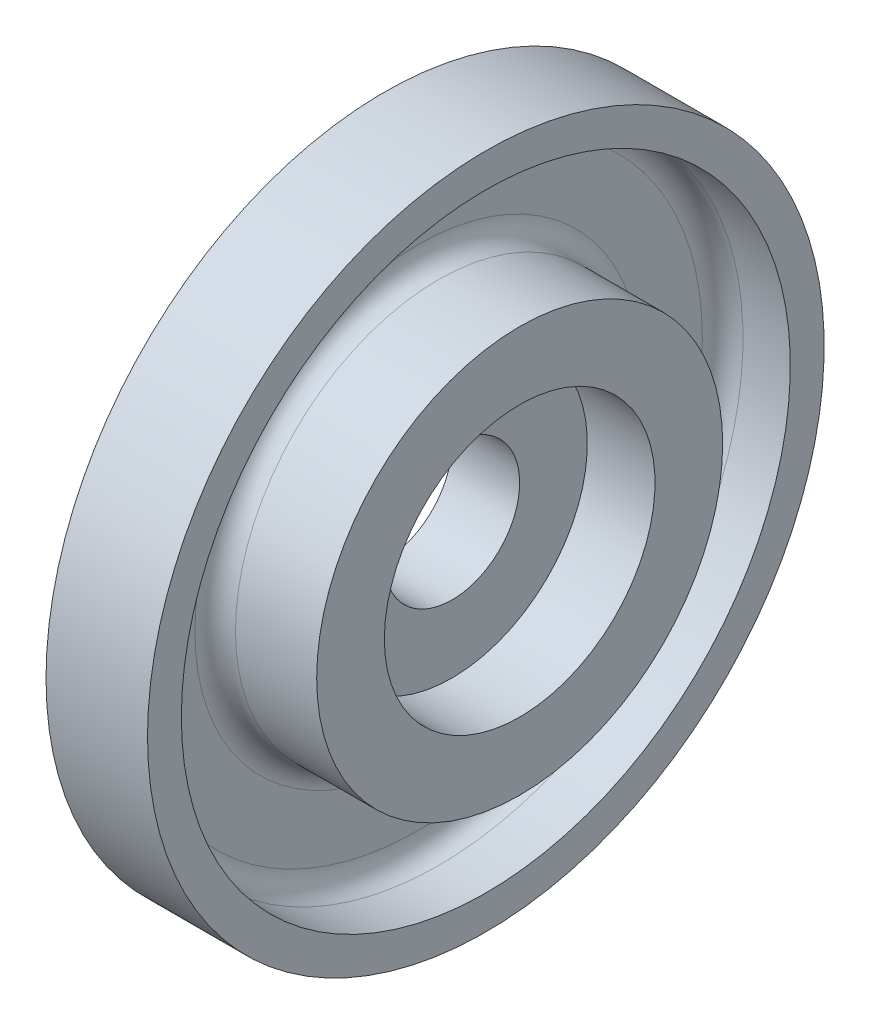
ISO-10303-21;
HEADER;
FILE_DESCRIPTION(('STEP AP214'),'2;1');
FILE_NAME('part.step','',(''),(''),'','','');
FILE_SCHEMA(('AUTOMOTIVE_DESIGN { 1 0 10303 214 1 1 1 1 }'));
ENDSEC;
DATA;
#1=APPLICATION_CONTEXT('core data for automotive mechanical design processes');
#2=APPLICATION_PROTOCOL_DEFINITION('international standard','automotive_design',2000,#1);
#3=PRODUCT_CONTEXT('',#1,'mechanical');
#4=PRODUCT('Part','Part','',(#3));
#5=PRODUCT_RELATED_PRODUCT_CATEGORY('part','',(#4));
#6=PRODUCT_DEFINITION_FORMATION('','',#4);
#7=PRODUCT_DEFINITION_CONTEXT('part definition',#1,'design');
#8=PRODUCT_DEFINITION('design','',#6,#7);
#9=PRODUCT_DEFINITION_SHAPE('','',#8);
#10=(LENGTH_UNIT() NAMED_UNIT(*) SI_UNIT(.MILLI.,.METRE.));
#11=(NAMED_UNIT(*) PLANE_ANGLE_UNIT() SI_UNIT($,.RADIAN.));
#12=(NAMED_UNIT(*) SI_UNIT($,.STERADIAN.) SOLID_ANGLE_UNIT());
#13=UNCERTAINTY_MEASURE_WITH_UNIT(LENGTH_MEASURE(1.E-05),#10,'distance_accuracy_value','');
#14=(GEOMETRIC_REPRESENTATION_CONTEXT(3) GLOBAL_UNCERTAINTY_ASSIGNED_CONTEXT((#13)) GLOBAL_UNIT_ASSIGNED_CONTEXT((#10,
#11,#12)) REPRESENTATION_CONTEXT('',''));
#15=CARTESIAN_POINT('',(0.,0.,0.));
#16=DIRECTION('',(0.,0.,1.));
#17=DIRECTION('',(1.,0.,0.));
#18=AXIS2_PLACEMENT_3D('',#15,#16,#17);
#19=CARTESIAN_POINT('',(-16.4847580469892,0.,0.));
#20=DIRECTION('',(-1.,0.,0.));
#21=DIRECTION('',(0.,0.,1.));
#22=AXIS2_PLACEMENT_3D('',#19,#20,#21);
#23=CYLINDRICAL_SURFACE('',#22,10.);
#24=CARTESIAN_POINT('',(10.,0.,0.));
#25=DIRECTION('',(-1.,0.,0.));
#26=DIRECTION('',(0.,0.,1.));
#27=AXIS2_PLACEMENT_3D('',#24,#25,#26);
#28=CIRCLE('',#27,10.);
#29=CARTESIAN_POINT('',(10.,0.,10.));
#30=VERTEX_POINT('',#29);
#31=EDGE_CURVE('E10',#30,#30,#28,.T.);
#32=ORIENTED_EDGE('',*,*,#31,.F.);
#33=EDGE_LOOP('',(#32));
#34=FACE_BOUND('',#33,.T.);
#35=CARTESIAN_POINT('',(0.,0.,0.));
#36=DIRECTION('',(-1.,0.,0.));
#37=DIRECTION('',(0.,0.,1.));
#38=AXIS2_PLACEMENT_3D('',#35,#36,#37);
#39=CIRCLE('',#38,9.99999999999999);
#40=CARTESIAN_POINT('',(0.,0.,9.99999999999999));
#41=VERTEX_POINT('',#40);
#42=EDGE_CURVE('E70',#41,#41,#39,.T.);
#43=ORIENTED_EDGE('',*,*,#42,.T.);
#44=EDGE_LOOP('',(#43));
#45=FACE_BOUND('',#44,.T.);
#46=ADVANCED_FACE('F30',(#34,#45),#23,.F.);
#47=CARTESIAN_POINT('',(10.,20.,0.));
#48=DIRECTION('',(-1.,0.,0.));
#49=DIRECTION('',(0.,0.,1.));
#50=AXIS2_PLACEMENT_3D('',#47,#48,#49);
#51=PLANE('',#50);
#52=CARTESIAN_POINT('',(10.,0.,0.));
#53=DIRECTION('',(-1.,0.,0.));
#54=DIRECTION('',(0.,0.,1.));
#55=AXIS2_PLACEMENT_3D('',#52,#53,#54);
#56=CIRCLE('',#55,20.);
#57=CARTESIAN_POINT('',(10.,0.,20.));
#58=VERTEX_POINT('',#57);
#59=EDGE_CURVE('E36',#58,#58,#56,.T.);
#60=ORIENTED_EDGE('',*,*,#59,.F.);
#61=EDGE_LOOP('',(#60));
#62=FACE_BOUND('',#61,.T.);
#63=ORIENTED_EDGE('',*,*,#31,.T.);
#64=EDGE_LOOP('',(#63));
#65=FACE_BOUND('',#64,.T.);
#66=ADVANCED_FACE('F131',(#62,#65),#51,.F.);
#67=CARTESIAN_POINT('',(-16.4847580469892,0.,0.));
#68=DIRECTION('',(-1.,0.,0.));
#69=DIRECTION('',(0.,0.,1.));
#70=AXIS2_PLACEMENT_3D('',#67,#68,#69);
#71=CYLINDRICAL_SURFACE('',#70,20.);
#72=CARTESIAN_POINT('',(20.,0.,0.));
#73=DIRECTION('',(-1.,0.,0.));
#74=DIRECTION('',(0.,0.,1.));
#75=AXIS2_PLACEMENT_3D('',#72,#73,#74);
#76=CIRCLE('',#75,20.);
#77=CARTESIAN_POINT('',(20.,0.,20.));
#78=VERTEX_POINT('',#77);
#79=EDGE_CURVE('E40',#78,#78,#76,.T.);
#80=ORIENTED_EDGE('',*,*,#79,.F.);
#81=EDGE_LOOP('',(#80));
#82=FACE_BOUND('',#81,.T.);
#83=ORIENTED_EDGE('',*,*,#59,.T.);
#84=EDGE_LOOP('',(#83));
#85=FACE_BOUND('',#84,.T.);
#86=ADVANCED_FACE('F126',(#82,#85),#71,.F.);
#87=CARTESIAN_POINT('',(20.,30.,0.));
#88=DIRECTION('',(-1.,0.,0.));
#89=DIRECTION('',(0.,0.,1.));
#90=AXIS2_PLACEMENT_3D('',#87,#88,#89);
#91=PLANE('',#90);
#92=CARTESIAN_POINT('',(20.,0.,0.));
#93=DIRECTION('',(-1.,0.,0.));
#94=DIRECTION('',(0.,0.,1.));
#95=AXIS2_PLACEMENT_3D('',#92,#93,#94);
#96=CIRCLE('',#95,30.);
#97=CARTESIAN_POINT('',(20.,0.,30.));
#98=VERTEX_POINT('',#97);
#99=EDGE_CURVE('E44',#98,#98,#96,.T.);
#100=ORIENTED_EDGE('',*,*,#99,.F.);
#101=EDGE_LOOP('',(#100));
#102=FACE_BOUND('',#101,.T.);
#103=ORIENTED_EDGE('',*,*,#79,.T.);
#104=EDGE_LOOP('',(#103));
#105=FACE_BOUND('',#104,.T.);
#106=ADVANCED_FACE('F120',(#102,#105),#91,.F.);
#107=CARTESIAN_POINT('',(-16.4847580469892,0.,0.));
#108=DIRECTION('',(-1.,0.,0.));
#109=DIRECTION('',(0.,0.,1.));
#110=AXIS2_PLACEMENT_3D('',#107,#108,#109);
#111=CYLINDRICAL_SURFACE('',#110,30.);
#112=CARTESIAN_POINT('',(8.00000000000002,0.,0.));
#113=DIRECTION('',(-1.,0.,0.));
#114=DIRECTION('',(0.,0.,1.));
#115=AXIS2_PLACEMENT_3D('',#112,#113,#114);
#116=CIRCLE('',#115,30.);
#117=CARTESIAN_POINT('',(8.00000000000002,0.,30.));
#118=VERTEX_POINT('',#117);
#119=EDGE_CURVE('E49',#118,#118,#116,.T.);
#120=ORIENTED_EDGE('',*,*,#119,.F.);
#121=EDGE_LOOP('',(#120));
#122=FACE_BOUND('',#121,.T.);
#123=ORIENTED_EDGE('',*,*,#99,.T.);
#124=EDGE_LOOP('',(#123));
#125=FACE_BOUND('',#124,.T.);
#126=ADVANCED_FACE('F114',(#122,#125),#111,.T.);
#127=CARTESIAN_POINT('',(8.,0.,0.));
#128=DIRECTION('',(-1.,0.,0.));
#129=DIRECTION('',(0.,0.,1.));
#130=AXIS2_PLACEMENT_3D('',#127,#128,#129);
#131=TOROIDAL_SURFACE('',#130,33.,3.);
#132=CARTESIAN_POINT('',(5.,0.,0.));
#133=DIRECTION('',(-1.,0.,0.));
#134=DIRECTION('',(0.,0.,1.));
#135=AXIS2_PLACEMENT_3D('',#132,#133,#134);
#136=CIRCLE('',#135,33.);
#137=CARTESIAN_POINT('',(5.,0.,33.));
#138=VERTEX_POINT('',#137);
#139=EDGE_CURVE('E52',#138,#138,#136,.T.);
#140=ORIENTED_EDGE('',*,*,#139,.F.);
#141=EDGE_LOOP('',(#140));
#142=FACE_BOUND('',#141,.T.);
#143=ORIENTED_EDGE('',*,*,#119,.T.);
#144=EDGE_LOOP('',(#143));
#145=FACE_BOUND('',#144,.T.);
#146=ADVANCED_FACE('F108',(#142,#145),#131,.F.);
#147=CARTESIAN_POINT('',(5.,42.,0.));
#148=DIRECTION('',(-1.,0.,0.));
#149=DIRECTION('',(0.,0.,1.));
#150=AXIS2_PLACEMENT_3D('',#147,#148,#149);
#151=PLANE('',#150);
#152=CARTESIAN_POINT('',(5.,0.,0.));
#153=DIRECTION('',(-1.,0.,0.));
#154=DIRECTION('',(0.,0.,1.));
#155=AXIS2_PLACEMENT_3D('',#152,#153,#154);
#156=CIRCLE('',#155,42.);
#157=CARTESIAN_POINT('',(5.,0.,42.));
#158=VERTEX_POINT('',#157);
#159=EDGE_CURVE('E55',#158,#158,#156,.T.);
#160=ORIENTED_EDGE('',*,*,#159,.F.);
#161=EDGE_LOOP('',(#160));
#162=FACE_BOUND('',#161,.T.);
#163=ORIENTED_EDGE('',*,*,#139,.T.);
#164=EDGE_LOOP('',(#163));
#165=FACE_BOUND('',#164,.T.);
#166=ADVANCED_FACE('F102',(#162,#165),#151,.F.);
#167=CARTESIAN_POINT('',(8.,0.,0.));
#168=DIRECTION('',(-1.,0.,0.));
#169=DIRECTION('',(0.,0.,1.));
#170=AXIS2_PLACEMENT_3D('',#167,#168,#169);
#171=TOROIDAL_SURFACE('',#170,42.,3.);
#172=CARTESIAN_POINT('',(8.00000000000002,0.,0.));
#173=DIRECTION('',(-1.,0.,0.));
#174=DIRECTION('',(0.,0.,1.));
#175=AXIS2_PLACEMENT_3D('',#172,#173,#174);
#176=CIRCLE('',#175,45.);
#177=CARTESIAN_POINT('',(8.00000000000002,0.,45.));
#178=VERTEX_POINT('',#177);
#179=EDGE_CURVE('E58',#178,#178,#176,.T.);
#180=ORIENTED_EDGE('',*,*,#179,.F.);
#181=EDGE_LOOP('',(#180));
#182=FACE_BOUND('',#181,.T.);
#183=ORIENTED_EDGE('',*,*,#159,.T.);
#184=EDGE_LOOP('',(#183));
#185=FACE_BOUND('',#184,.T.);
#186=ADVANCED_FACE('F96',(#182,#185),#171,.F.);
#187=CARTESIAN_POINT('',(-16.4847580469892,0.,0.));
#188=DIRECTION('',(-1.,0.,0.));
#189=DIRECTION('',(0.,0.,1.));
#190=AXIS2_PLACEMENT_3D('',#187,#188,#189);
#191=CYLINDRICAL_SURFACE('',#190,45.);
#192=CARTESIAN_POINT('',(15.,0.,0.));
#193=DIRECTION('',(-1.,0.,0.));
#194=DIRECTION('',(0.,0.,1.));
#195=AXIS2_PLACEMENT_3D('',#192,#193,#194);
#196=CIRCLE('',#195,45.);
#197=CARTESIAN_POINT('',(15.,0.,45.));
#198=VERTEX_POINT('',#197);
#199=EDGE_CURVE('E61',#198,#198,#196,.T.);
#200=ORIENTED_EDGE('',*,*,#199,.F.);
#201=EDGE_LOOP('',(#200));
#202=FACE_BOUND('',#201,.T.);
#203=ORIENTED_EDGE('',*,*,#179,.T.);
#204=EDGE_LOOP('',(#203));
#205=FACE_BOUND('',#204,.T.);
#206=ADVANCED_FACE('F90',(#202,#205),#191,.F.);
#207=CARTESIAN_POINT('',(15.,50.,0.));
#208=DIRECTION('',(-1.,0.,0.));
#209=DIRECTION('',(0.,0.,1.));
#210=AXIS2_PLACEMENT_3D('',#207,#208,#209);
#211=PLANE('',#210);
#212=CARTESIAN_POINT('',(15.,0.,0.));
#213=DIRECTION('',(-1.,0.,0.));
#214=DIRECTION('',(0.,0.,1.));
#215=AXIS2_PLACEMENT_3D('',#212,#213,#214);
#216=CIRCLE('',#215,50.);
#217=CARTESIAN_POINT('',(15.,0.,50.));
#218=VERTEX_POINT('',#217);
#219=EDGE_CURVE('E64',#218,#218,#216,.T.);
#220=ORIENTED_EDGE('',*,*,#219,.F.);
#221=EDGE_LOOP('',(#220));
#222=FACE_BOUND('',#221,.T.);
#223=ORIENTED_EDGE('',*,*,#199,.T.);
#224=EDGE_LOOP('',(#223));
#225=FACE_BOUND('',#224,.T.);
#226=ADVANCED_FACE('F84',(#222,#225),#211,.F.);
#227=CARTESIAN_POINT('',(-16.4847580469892,0.,0.));
#228=DIRECTION('',(-1.,0.,0.));
#229=DIRECTION('',(0.,0.,1.));
#230=AXIS2_PLACEMENT_3D('',#227,#228,#229);
#231=CYLINDRICAL_SURFACE('',#230,50.);
#232=CARTESIAN_POINT('',(0.,0.,0.));
#233=DIRECTION('',(-1.,0.,0.));
#234=DIRECTION('',(0.,0.,1.));
#235=AXIS2_PLACEMENT_3D('',#232,#233,#234);
#236=CIRCLE('',#235,50.);
#237=CARTESIAN_POINT('',(0.,0.,50.));
#238=VERTEX_POINT('',#237);
#239=EDGE_CURVE('E67',#238,#238,#236,.T.);
#240=ORIENTED_EDGE('',*,*,#239,.F.);
#241=EDGE_LOOP('',(#240));
#242=FACE_BOUND('',#241,.T.);
#243=ORIENTED_EDGE('',*,*,#219,.T.);
#244=EDGE_LOOP('',(#243));
#245=FACE_BOUND('',#244,.T.);
#246=ADVANCED_FACE('F78',(#242,#245),#231,.T.);
#247=CARTESIAN_POINT('',(0.,9.99999999999999,0.));
#248=DIRECTION('',(1.,0.,0.));
#249=DIRECTION('',(0.,0.,-1.));
#250=AXIS2_PLACEMENT_3D('',#247,#248,#249);
#251=PLANE('',#250);
#252=ORIENTED_EDGE('',*,*,#42,.F.);
#253=EDGE_LOOP('',(#252));
#254=FACE_BOUND('',#253,.T.);
#255=ORIENTED_EDGE('',*,*,#239,.T.);
#256=EDGE_LOOP('',(#255));
#257=FACE_BOUND('',#256,.T.);
#258=ADVANCED_FACE('F75',(#254,#257),#251,.F.);
#259=CLOSED_SHELL('',(#46,#66,#86,#106,#126,#146,#166,#186,#206,#226,#246,#258));
#260=MANIFOLD_SOLID_BREP('B2',#259);
#261=ADVANCED_BREP_SHAPE_REPRESENTATION('',(#18,#260),#14);
#262=SHAPE_DEFINITION_REPRESENTATION(#9,#261);
ENDSEC;
END-ISO-10303-21;
